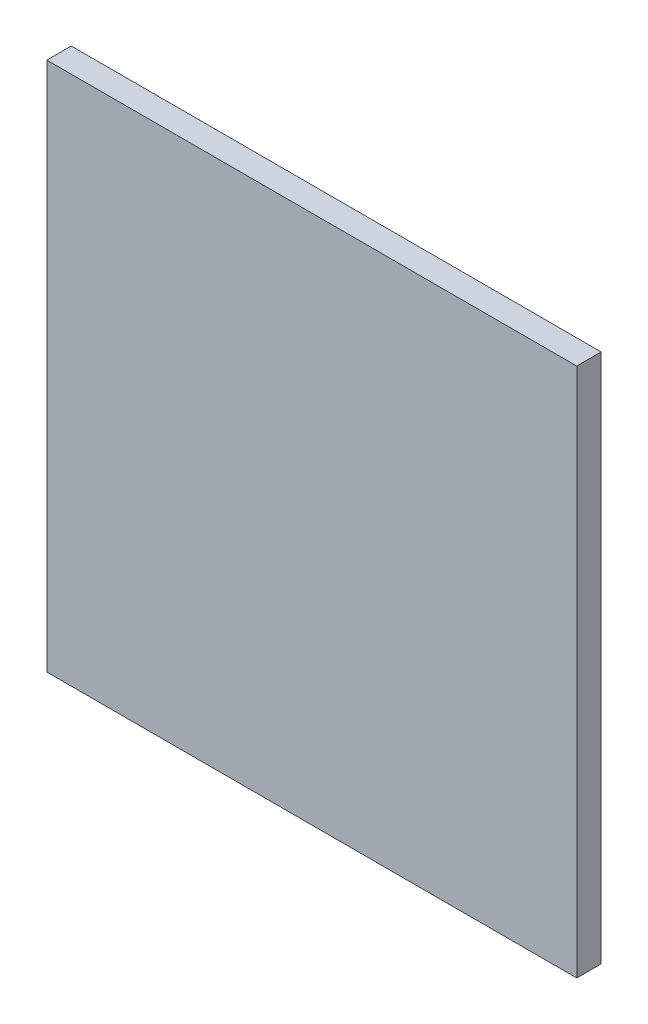
ISO-10303-21;
HEADER;
FILE_DESCRIPTION(('STEP AP214'),'2;1');
FILE_NAME('part.step','',(''),(''),'','','');
FILE_SCHEMA(('AUTOMOTIVE_DESIGN { 1 0 10303 214 1 1 1 1 }'));
ENDSEC;
DATA;
#1=APPLICATION_CONTEXT('core data for automotive mechanical design processes');
#2=APPLICATION_PROTOCOL_DEFINITION('international standard','automotive_design',2000,#1);
#3=PRODUCT_CONTEXT('',#1,'mechanical');
#4=PRODUCT('Part','Part','',(#3));
#5=PRODUCT_RELATED_PRODUCT_CATEGORY('part','',(#4));
#6=PRODUCT_DEFINITION_FORMATION('','',#4);
#7=PRODUCT_DEFINITION_CONTEXT('part definition',#1,'design');
#8=PRODUCT_DEFINITION('design','',#6,#7);
#9=PRODUCT_DEFINITION_SHAPE('','',#8);
#10=(LENGTH_UNIT() NAMED_UNIT(*) SI_UNIT(.MILLI.,.METRE.));
#11=(NAMED_UNIT(*) PLANE_ANGLE_UNIT() SI_UNIT($,.RADIAN.));
#12=(NAMED_UNIT(*) SI_UNIT($,.STERADIAN.) SOLID_ANGLE_UNIT());
#13=UNCERTAINTY_MEASURE_WITH_UNIT(LENGTH_MEASURE(1.E-05),#10,'distance_accuracy_value','');
#14=(GEOMETRIC_REPRESENTATION_CONTEXT(3) GLOBAL_UNCERTAINTY_ASSIGNED_CONTEXT((#13)) GLOBAL_UNIT_ASSIGNED_CONTEXT((#10,
#11,#12)) REPRESENTATION_CONTEXT('',''));
#15=CARTESIAN_POINT('',(0.,0.,0.));
#16=DIRECTION('',(0.,0.,1.));
#17=DIRECTION('',(1.,0.,0.));
#18=AXIS2_PLACEMENT_3D('',#15,#16,#17);
#19=CARTESIAN_POINT('',(35.585,-35.585,3.28));
#20=DIRECTION('',(-1.,0.,0.));
#21=DIRECTION('',(0.,0.,1.));
#22=AXIS2_PLACEMENT_3D('',#19,#20,#21);
#23=PLANE('',#22);
#24=DIRECTION('',(0.,1.,0.));
#25=VECTOR('',#24,1.);
#26=CARTESIAN_POINT('',(35.585,-35.585,0.));
#27=LINE('',#26,#25);
#28=CARTESIAN_POINT('',(35.585,-35.585,0.));
#29=VERTEX_POINT('',#28);
#30=CARTESIAN_POINT('',(35.585,35.585,0.));
#31=VERTEX_POINT('',#30);
#32=EDGE_CURVE('E113',#29,#31,#27,.T.);
#33=ORIENTED_EDGE('',*,*,#32,.T.);
#34=DIRECTION('',(0.,0.,-1.));
#35=VECTOR('',#34,1.);
#36=CARTESIAN_POINT('',(35.585,35.585,3.28));
#37=LINE('',#36,#35);
#38=CARTESIAN_POINT('',(35.585,35.585,3.28));
#39=VERTEX_POINT('',#38);
#40=EDGE_CURVE('E11',#39,#31,#37,.T.);
#41=ORIENTED_EDGE('',*,*,#40,.F.);
#42=DIRECTION('',(0.,1.,0.));
#43=VECTOR('',#42,1.);
#44=CARTESIAN_POINT('',(35.585,-35.585,3.28));
#45=LINE('',#44,#43);
#46=CARTESIAN_POINT('',(35.585,-35.585,3.28));
#47=VERTEX_POINT('',#46);
#48=EDGE_CURVE('E97',#47,#39,#45,.T.);
#49=ORIENTED_EDGE('',*,*,#48,.F.);
#50=DIRECTION('',(0.,0.,-1.));
#51=VECTOR('',#50,1.);
#52=CARTESIAN_POINT('',(35.585,-35.585,3.28));
#53=LINE('',#52,#51);
#54=EDGE_CURVE('E109',#47,#29,#53,.T.);
#55=ORIENTED_EDGE('',*,*,#54,.T.);
#56=EDGE_LOOP('',(#33,#41,#49,#55));
#57=FACE_BOUND('',#56,.T.);
#58=ADVANCED_FACE('F45',(#57),#23,.F.);
#59=CARTESIAN_POINT('',(-35.585,35.585,3.28));
#60=DIRECTION('',(0.,-1.,0.));
#61=DIRECTION('',(0.,0.,-1.));
#62=AXIS2_PLACEMENT_3D('',#59,#60,#61);
#63=PLANE('',#62);
#64=DIRECTION('',(-1.,0.,0.));
#65=VECTOR('',#64,1.);
#66=CARTESIAN_POINT('',(-35.585,35.585,0.));
#67=LINE('',#66,#65);
#68=CARTESIAN_POINT('',(-35.585,35.585,0.));
#69=VERTEX_POINT('',#68);
#70=EDGE_CURVE('E102',#31,#69,#67,.T.);
#71=ORIENTED_EDGE('',*,*,#70,.T.);
#72=DIRECTION('',(0.,0.,-1.));
#73=VECTOR('',#72,1.);
#74=CARTESIAN_POINT('',(-35.585,35.585,3.28));
#75=LINE('',#74,#73);
#76=CARTESIAN_POINT('',(-35.585,35.585,3.28));
#77=VERTEX_POINT('',#76);
#78=EDGE_CURVE('E54',#77,#69,#75,.T.);
#79=ORIENTED_EDGE('',*,*,#78,.F.);
#80=DIRECTION('',(-1.,0.,0.));
#81=VECTOR('',#80,1.);
#82=CARTESIAN_POINT('',(-35.585,35.585,3.28));
#83=LINE('',#82,#81);
#84=EDGE_CURVE('E92',#39,#77,#83,.T.);
#85=ORIENTED_EDGE('',*,*,#84,.F.);
#86=ORIENTED_EDGE('',*,*,#40,.T.);
#87=EDGE_LOOP('',(#71,#79,#85,#86));
#88=FACE_BOUND('',#87,.T.);
#89=ADVANCED_FACE('F101',(#88),#63,.F.);
#90=CARTESIAN_POINT('',(-35.585,-35.585,3.28));
#91=DIRECTION('',(1.,0.,0.));
#92=DIRECTION('',(0.,0.,-1.));
#93=AXIS2_PLACEMENT_3D('',#90,#91,#92);
#94=PLANE('',#93);
#95=DIRECTION('',(0.,-1.,0.));
#96=VECTOR('',#95,1.);
#97=CARTESIAN_POINT('',(-35.585,-35.585,0.));
#98=LINE('',#97,#96);
#99=CARTESIAN_POINT('',(-35.585,-35.585,0.));
#100=VERTEX_POINT('',#99);
#101=EDGE_CURVE('E79',#69,#100,#98,.T.);
#102=ORIENTED_EDGE('',*,*,#101,.T.);
#103=DIRECTION('',(0.,0.,-1.));
#104=VECTOR('',#103,1.);
#105=CARTESIAN_POINT('',(-35.585,-35.585,3.28));
#106=LINE('',#105,#104);
#107=CARTESIAN_POINT('',(-35.585,-35.585,3.28));
#108=VERTEX_POINT('',#107);
#109=EDGE_CURVE('E104',#108,#100,#106,.T.);
#110=ORIENTED_EDGE('',*,*,#109,.F.);
#111=DIRECTION('',(0.,-1.,0.));
#112=VECTOR('',#111,1.);
#113=CARTESIAN_POINT('',(-35.585,-35.585,3.28));
#114=LINE('',#113,#112);
#115=EDGE_CURVE('E95',#77,#108,#114,.T.);
#116=ORIENTED_EDGE('',*,*,#115,.F.);
#117=ORIENTED_EDGE('',*,*,#78,.T.);
#118=EDGE_LOOP('',(#102,#110,#116,#117));
#119=FACE_BOUND('',#118,.T.);
#120=ADVANCED_FACE('F105',(#119),#94,.F.);
#121=CARTESIAN_POINT('',(-35.585,-35.585,3.28));
#122=DIRECTION('',(0.,1.,0.));
#123=DIRECTION('',(0.,0.,1.));
#124=AXIS2_PLACEMENT_3D('',#121,#122,#123);
#125=PLANE('',#124);
#126=DIRECTION('',(1.,0.,0.));
#127=VECTOR('',#126,1.);
#128=CARTESIAN_POINT('',(-35.585,-35.585,0.));
#129=LINE('',#128,#127);
#130=EDGE_CURVE('E85',#100,#29,#129,.T.);
#131=ORIENTED_EDGE('',*,*,#130,.T.);
#132=ORIENTED_EDGE('',*,*,#54,.F.);
#133=DIRECTION('',(1.,0.,0.));
#134=VECTOR('',#133,1.);
#135=CARTESIAN_POINT('',(-35.585,-35.585,3.28));
#136=LINE('',#135,#134);
#137=EDGE_CURVE('E62',#108,#47,#136,.T.);
#138=ORIENTED_EDGE('',*,*,#137,.F.);
#139=ORIENTED_EDGE('',*,*,#109,.T.);
#140=EDGE_LOOP('',(#131,#132,#138,#139));
#141=FACE_BOUND('',#140,.T.);
#142=ADVANCED_FACE('F126',(#141),#125,.F.);
#143=CARTESIAN_POINT('',(0.,0.,3.28));
#144=DIRECTION('',(0.,0.,-1.));
#145=DIRECTION('',(-1.,0.,0.));
#146=AXIS2_PLACEMENT_3D('',#143,#144,#145);
#147=PLANE('',#146);
#148=ORIENTED_EDGE('',*,*,#48,.T.);
#149=ORIENTED_EDGE('',*,*,#84,.T.);
#150=ORIENTED_EDGE('',*,*,#115,.T.);
#151=ORIENTED_EDGE('',*,*,#137,.T.);
#152=EDGE_LOOP('',(#148,#149,#150,#151));
#153=FACE_BOUND('',#152,.T.);
#154=ADVANCED_FACE('F93',(#153),#147,.F.);
#155=CARTESIAN_POINT('',(0.,0.,0.));
#156=DIRECTION('',(0.,0.,-1.));
#157=DIRECTION('',(-1.,0.,0.));
#158=AXIS2_PLACEMENT_3D('',#155,#156,#157);
#159=PLANE('',#158);
#160=ORIENTED_EDGE('',*,*,#32,.F.);
#161=ORIENTED_EDGE('',*,*,#130,.F.);
#162=ORIENTED_EDGE('',*,*,#101,.F.);
#163=ORIENTED_EDGE('',*,*,#70,.F.);
#164=EDGE_LOOP('',(#160,#161,#162,#163));
#165=FACE_BOUND('',#164,.T.);
#166=ADVANCED_FACE('F129',(#165),#159,.T.);
#167=CLOSED_SHELL('',(#58,#89,#120,#142,#154,#166));
#168=MANIFOLD_SOLID_BREP('B2',#167);
#169=ADVANCED_BREP_SHAPE_REPRESENTATION('',(#18,#168),#14);
#170=SHAPE_DEFINITION_REPRESENTATION(#9,#169);
ENDSEC;
END-ISO-10303-21;
